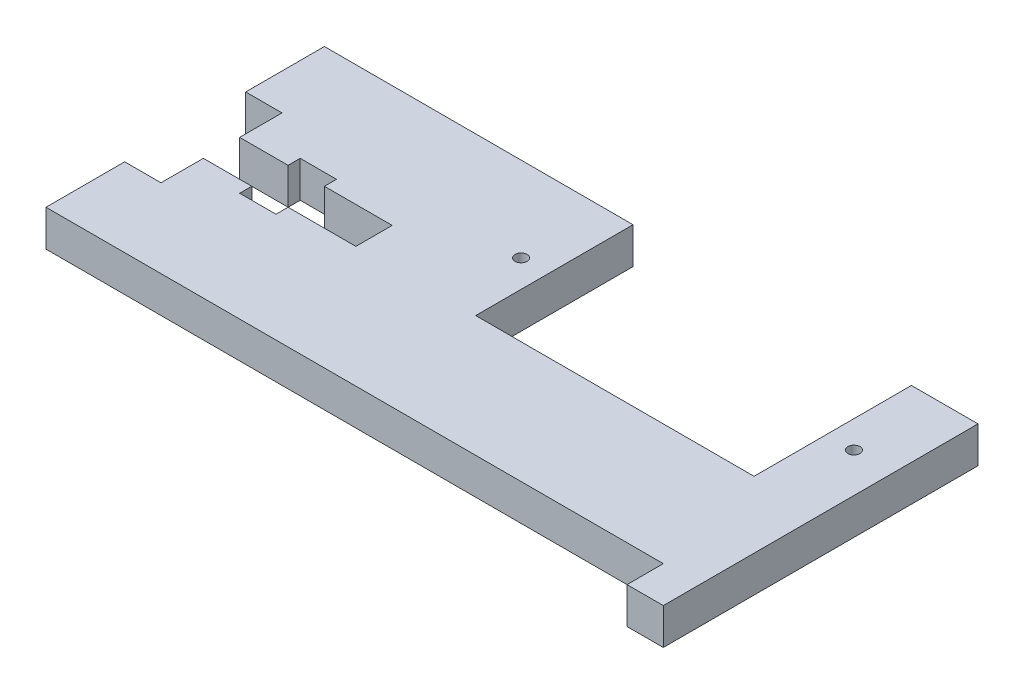
ISO-10303-21;
HEADER;
FILE_DESCRIPTION(('STEP AP214'),'2;1');
FILE_NAME('part.step','',(''),(''),'','','');
FILE_SCHEMA(('AUTOMOTIVE_DESIGN { 1 0 10303 214 1 1 1 1 }'));
ENDSEC;
DATA;
#1=APPLICATION_CONTEXT('core data for automotive mechanical design processes');
#2=APPLICATION_PROTOCOL_DEFINITION('international standard','automotive_design',2000,#1);
#3=PRODUCT_CONTEXT('',#1,'mechanical');
#4=PRODUCT('Part','Part','',(#3));
#5=PRODUCT_RELATED_PRODUCT_CATEGORY('part','',(#4));
#6=PRODUCT_DEFINITION_FORMATION('','',#4);
#7=PRODUCT_DEFINITION_CONTEXT('part definition',#1,'design');
#8=PRODUCT_DEFINITION('design','',#6,#7);
#9=PRODUCT_DEFINITION_SHAPE('','',#8);
#10=(LENGTH_UNIT() NAMED_UNIT(*) SI_UNIT(.MILLI.,.METRE.));
#11=(NAMED_UNIT(*) PLANE_ANGLE_UNIT() SI_UNIT($,.RADIAN.));
#12=(NAMED_UNIT(*) SI_UNIT($,.STERADIAN.) SOLID_ANGLE_UNIT());
#13=UNCERTAINTY_MEASURE_WITH_UNIT(LENGTH_MEASURE(1.E-05),#10,'distance_accuracy_value','');
#14=(GEOMETRIC_REPRESENTATION_CONTEXT(3) GLOBAL_UNCERTAINTY_ASSIGNED_CONTEXT((#13)) GLOBAL_UNIT_ASSIGNED_CONTEXT((#10,
#11,#12)) REPRESENTATION_CONTEXT('',''));
#15=CARTESIAN_POINT('',(0.,0.,0.));
#16=DIRECTION('',(0.,0.,1.));
#17=DIRECTION('',(1.,0.,0.));
#18=AXIS2_PLACEMENT_3D('',#15,#16,#17);
#19=CARTESIAN_POINT('',(0.,3.,0.));
#20=DIRECTION('',(0.,1.,0.));
#21=DIRECTION('',(0.,0.,1.));
#22=AXIS2_PLACEMENT_3D('',#19,#20,#21);
#23=PLANE('',#22);
#24=CARTESIAN_POINT('',(-22.7327283773411,3.,-9.5));
#25=DIRECTION('',(0.,1.,0.));
#26=DIRECTION('',(0.,0.,1.));
#27=AXIS2_PLACEMENT_3D('',#24,#25,#26);
#28=CIRCLE('',#27,0.500000000000003);
#29=CARTESIAN_POINT('',(-22.7327283773411,3.,-9.));
#30=VERTEX_POINT('',#29);
#31=EDGE_CURVE('E248',#30,#30,#28,.T.);
#32=ORIENTED_EDGE('',*,*,#31,.F.);
#33=EDGE_LOOP('',(#32));
#34=FACE_BOUND('',#33,.T.);
#35=DIRECTION('',(-1.,0.,0.));
#36=VECTOR('',#35,1.);
#37=CARTESIAN_POINT('',(-45.9827283773411,3.,0.));
#38=LINE('',#37,#36);
#39=CARTESIAN_POINT('',(-42.9827283773411,3.,0.));
#40=VERTEX_POINT('',#39);
#41=CARTESIAN_POINT('',(-45.9827283773411,3.,0.));
#42=VERTEX_POINT('',#41);
#43=EDGE_CURVE('E300',#40,#42,#38,.T.);
#44=ORIENTED_EDGE('',*,*,#43,.T.);
#45=DIRECTION('',(0.,0.,1.));
#46=VECTOR('',#45,1.);
#47=CARTESIAN_POINT('',(-45.9827283773411,3.,0.));
#48=LINE('',#47,#46);
#49=CARTESIAN_POINT('',(-45.9827283773411,3.,6.5));
#50=VERTEX_POINT('',#49);
#51=EDGE_CURVE('E154',#42,#50,#48,.T.);
#52=ORIENTED_EDGE('',*,*,#51,.T.);
#53=DIRECTION('',(1.,0.,0.));
#54=VECTOR('',#53,1.);
#55=CARTESIAN_POINT('',(-45.9827283773411,3.,6.5));
#56=LINE('',#55,#54);
#57=CARTESIAN_POINT('',(5.01727162265887,3.,6.5));
#58=VERTEX_POINT('',#57);
#59=EDGE_CURVE('E368',#50,#58,#56,.T.);
#60=ORIENTED_EDGE('',*,*,#59,.T.);
#61=DIRECTION('',(0.,0.,1.));
#62=VECTOR('',#61,1.);
#63=CARTESIAN_POINT('',(5.01727162265887,3.,6.5));
#64=LINE('',#63,#62);
#65=CARTESIAN_POINT('',(5.01727162265887,3.,9.5));
#66=VERTEX_POINT('',#65);
#67=EDGE_CURVE('E384',#58,#66,#64,.T.);
#68=ORIENTED_EDGE('',*,*,#67,.T.);
#69=DIRECTION('',(1.,0.,0.));
#70=VECTOR('',#69,1.);
#71=CARTESIAN_POINT('',(5.01727162265887,3.,9.5));
#72=LINE('',#71,#70);
#73=CARTESIAN_POINT('',(8.01727162265886,3.,9.5));
#74=VERTEX_POINT('',#73);
#75=EDGE_CURVE('E385',#66,#74,#72,.T.);
#76=ORIENTED_EDGE('',*,*,#75,.T.);
#77=DIRECTION('',(0.,0.,-1.));
#78=VECTOR('',#77,1.);
#79=CARTESIAN_POINT('',(8.01727162265886,3.,9.5));
#80=LINE('',#79,#78);
#81=CARTESIAN_POINT('',(8.01727162265886,3.,-16.5));
#82=VERTEX_POINT('',#81);
#83=EDGE_CURVE('E383',#74,#82,#80,.T.);
#84=ORIENTED_EDGE('',*,*,#83,.T.);
#85=DIRECTION('',(-1.,0.,0.));
#86=VECTOR('',#85,1.);
#87=CARTESIAN_POINT('',(8.01727162265886,3.,-16.5));
#88=LINE('',#87,#86);
#89=CARTESIAN_POINT('',(2.51727162265887,3.,-16.5));
#90=VERTEX_POINT('',#89);
#91=EDGE_CURVE('E390',#82,#90,#88,.T.);
#92=ORIENTED_EDGE('',*,*,#91,.T.);
#93=DIRECTION('',(0.,0.,1.));
#94=VECTOR('',#93,1.);
#95=CARTESIAN_POINT('',(2.51727162265887,3.,-16.5));
#96=LINE('',#95,#94);
#97=CARTESIAN_POINT('',(2.51727162265887,3.,-3.5));
#98=VERTEX_POINT('',#97);
#99=EDGE_CURVE('E392',#90,#98,#96,.T.);
#100=ORIENTED_EDGE('',*,*,#99,.T.);
#101=DIRECTION('',(-1.,0.,0.));
#102=VECTOR('',#101,1.);
#103=CARTESIAN_POINT('',(2.51727162265887,3.,-3.5));
#104=LINE('',#103,#102);
#105=CARTESIAN_POINT('',(-20.4827283773411,3.,-3.5));
#106=VERTEX_POINT('',#105);
#107=EDGE_CURVE('E394',#98,#106,#104,.T.);
#108=ORIENTED_EDGE('',*,*,#107,.T.);
#109=DIRECTION('',(0.,0.,-1.));
#110=VECTOR('',#109,1.);
#111=CARTESIAN_POINT('',(-20.4827283773411,3.,-3.5));
#112=LINE('',#111,#110);
#113=CARTESIAN_POINT('',(-20.4827283773411,3.,-16.5));
#114=VERTEX_POINT('',#113);
#115=EDGE_CURVE('E399',#106,#114,#112,.T.);
#116=ORIENTED_EDGE('',*,*,#115,.T.);
#117=DIRECTION('',(-1.,0.,0.));
#118=VECTOR('',#117,1.);
#119=CARTESIAN_POINT('',(-20.4827283773411,3.,-16.5));
#120=LINE('',#119,#118);
#121=CARTESIAN_POINT('',(-45.9827283773411,3.,-16.5));
#122=VERTEX_POINT('',#121);
#123=EDGE_CURVE('E396',#114,#122,#120,.T.);
#124=ORIENTED_EDGE('',*,*,#123,.T.);
#125=DIRECTION('',(0.,0.,1.));
#126=VECTOR('',#125,1.);
#127=CARTESIAN_POINT('',(-45.9827283773411,3.,-16.5));
#128=LINE('',#127,#126);
#129=CARTESIAN_POINT('',(-45.9827283773411,3.,-10.));
#130=VERTEX_POINT('',#129);
#131=EDGE_CURVE('E402',#122,#130,#128,.T.);
#132=ORIENTED_EDGE('',*,*,#131,.T.);
#133=DIRECTION('',(1.,0.,0.));
#134=VECTOR('',#133,1.);
#135=CARTESIAN_POINT('',(-45.9827283773411,3.,-10.));
#136=LINE('',#135,#134);
#137=CARTESIAN_POINT('',(-42.9827283773411,3.,-10.));
#138=VERTEX_POINT('',#137);
#139=EDGE_CURVE('E401',#130,#138,#136,.T.);
#140=ORIENTED_EDGE('',*,*,#139,.T.);
#141=DIRECTION('',(0.,0.,1.));
#142=VECTOR('',#141,1.);
#143=CARTESIAN_POINT('',(-42.9827283773411,3.,-10.));
#144=LINE('',#143,#142);
#145=CARTESIAN_POINT('',(-42.9827283773411,3.,-6.5));
#146=VERTEX_POINT('',#145);
#147=EDGE_CURVE('E403',#138,#146,#144,.T.);
#148=ORIENTED_EDGE('',*,*,#147,.T.);
#149=DIRECTION('',(1.,0.,0.));
#150=VECTOR('',#149,1.);
#151=CARTESIAN_POINT('',(-42.9827283773411,3.,-6.5));
#152=LINE('',#151,#150);
#153=CARTESIAN_POINT('',(-38.9827283773411,3.,-6.5));
#154=VERTEX_POINT('',#153);
#155=EDGE_CURVE('E410',#146,#154,#152,.T.);
#156=ORIENTED_EDGE('',*,*,#155,.T.);
#157=DIRECTION('',(0.,0.,-1.));
#158=VECTOR('',#157,1.);
#159=CARTESIAN_POINT('',(-38.9827283773411,3.,-6.5));
#160=LINE('',#159,#158);
#161=CARTESIAN_POINT('',(-38.9827283773411,3.,-7.5));
#162=VERTEX_POINT('',#161);
#163=EDGE_CURVE('E408',#154,#162,#160,.T.);
#164=ORIENTED_EDGE('',*,*,#163,.T.);
#165=DIRECTION('',(1.,0.,0.));
#166=VECTOR('',#165,1.);
#167=CARTESIAN_POINT('',(-38.9827283773411,3.,-7.5));
#168=LINE('',#167,#166);
#169=CARTESIAN_POINT('',(-35.9827283773411,3.,-7.5));
#170=VERTEX_POINT('',#169);
#171=EDGE_CURVE('E412',#162,#170,#168,.T.);
#172=ORIENTED_EDGE('',*,*,#171,.T.);
#173=DIRECTION('',(0.,0.,1.));
#174=VECTOR('',#173,1.);
#175=CARTESIAN_POINT('',(-35.9827283773411,3.,-7.5));
#176=LINE('',#175,#174);
#177=CARTESIAN_POINT('',(-35.9827283773411,3.,-6.5));
#178=VERTEX_POINT('',#177);
#179=EDGE_CURVE('E415',#170,#178,#176,.T.);
#180=ORIENTED_EDGE('',*,*,#179,.T.);
#181=DIRECTION('',(1.,0.,0.));
#182=VECTOR('',#181,1.);
#183=CARTESIAN_POINT('',(-35.9827283773411,3.,-6.5));
#184=LINE('',#183,#182);
#185=CARTESIAN_POINT('',(-30.3827283773411,3.,-6.5));
#186=VERTEX_POINT('',#185);
#187=EDGE_CURVE('E413',#178,#186,#184,.T.);
#188=ORIENTED_EDGE('',*,*,#187,.T.);
#189=DIRECTION('',(0.,0.,1.));
#190=VECTOR('',#189,1.);
#191=CARTESIAN_POINT('',(-30.3827283773411,3.,-6.5));
#192=LINE('',#191,#190);
#193=CARTESIAN_POINT('',(-30.3827283773411,3.,-3.5));
#194=VERTEX_POINT('',#193);
#195=EDGE_CURVE('E417',#186,#194,#192,.T.);
#196=ORIENTED_EDGE('',*,*,#195,.T.);
#197=DIRECTION('',(-1.,0.,0.));
#198=VECTOR('',#197,1.);
#199=CARTESIAN_POINT('',(-35.9827283773411,3.,-3.5));
#200=LINE('',#199,#198);
#201=CARTESIAN_POINT('',(-35.9827283773411,3.,-3.5));
#202=VERTEX_POINT('',#201);
#203=EDGE_CURVE('E420',#194,#202,#200,.T.);
#204=ORIENTED_EDGE('',*,*,#203,.T.);
#205=DIRECTION('',(0.,0.,1.));
#206=VECTOR('',#205,1.);
#207=CARTESIAN_POINT('',(-35.9827283773411,3.,-2.5));
#208=LINE('',#207,#206);
#209=CARTESIAN_POINT('',(-35.9827283773411,3.,-2.5));
#210=VERTEX_POINT('',#209);
#211=EDGE_CURVE('E423',#202,#210,#208,.T.);
#212=ORIENTED_EDGE('',*,*,#211,.T.);
#213=DIRECTION('',(-1.,0.,0.));
#214=VECTOR('',#213,1.);
#215=CARTESIAN_POINT('',(-38.9827283773411,3.,-2.5));
#216=LINE('',#215,#214);
#217=CARTESIAN_POINT('',(-38.9827283773411,3.,-2.5));
#218=VERTEX_POINT('',#217);
#219=EDGE_CURVE('E227',#210,#218,#216,.T.);
#220=ORIENTED_EDGE('',*,*,#219,.T.);
#221=DIRECTION('',(0.,0.,-1.));
#222=VECTOR('',#221,1.);
#223=CARTESIAN_POINT('',(-38.9827283773411,3.,-3.5));
#224=LINE('',#223,#222);
#225=CARTESIAN_POINT('',(-38.9827283773411,3.,-3.5));
#226=VERTEX_POINT('',#225);
#227=EDGE_CURVE('E225',#218,#226,#224,.T.);
#228=ORIENTED_EDGE('',*,*,#227,.T.);
#229=DIRECTION('',(-1.,0.,0.));
#230=VECTOR('',#229,1.);
#231=CARTESIAN_POINT('',(-42.9827283773411,3.,-3.5));
#232=LINE('',#231,#230);
#233=CARTESIAN_POINT('',(-42.9827283773411,3.,-3.5));
#234=VERTEX_POINT('',#233);
#235=EDGE_CURVE('E226',#226,#234,#232,.T.);
#236=ORIENTED_EDGE('',*,*,#235,.T.);
#237=DIRECTION('',(0.,0.,1.));
#238=VECTOR('',#237,1.);
#239=CARTESIAN_POINT('',(-42.9827283773411,3.,0.));
#240=LINE('',#239,#238);
#241=EDGE_CURVE('E59',#234,#40,#240,.T.);
#242=ORIENTED_EDGE('',*,*,#241,.T.);
#243=EDGE_LOOP('',(#44,#52,#60,#68,#76,#84,#92,#100,#108,#116,#124,#132,#140,#148,#156,#164,
#172,#180,#188,#196,#204,#212,#220,#228,#236,#242));
#244=FACE_BOUND('',#243,.T.);
#245=CARTESIAN_POINT('',(4.76727162265887,3.,-9.5));
#246=DIRECTION('',(0.,1.,0.));
#247=DIRECTION('',(0.,0.,1.));
#248=AXIS2_PLACEMENT_3D('',#245,#246,#247);
#249=CIRCLE('',#248,0.500000000000001);
#250=CARTESIAN_POINT('',(4.76727162265887,3.,-9.));
#251=VERTEX_POINT('',#250);
#252=EDGE_CURVE('E462',#251,#251,#249,.T.);
#253=ORIENTED_EDGE('',*,*,#252,.F.);
#254=EDGE_LOOP('',(#253));
#255=FACE_BOUND('',#254,.T.);
#256=ADVANCED_FACE('F41',(#34,#244,#255),#23,.T.);
#257=CARTESIAN_POINT('',(0.,0.,0.));
#258=DIRECTION('',(0.,1.,0.));
#259=DIRECTION('',(0.,0.,1.));
#260=AXIS2_PLACEMENT_3D('',#257,#258,#259);
#261=PLANE('',#260);
#262=DIRECTION('',(-1.,0.,0.));
#263=VECTOR('',#262,1.);
#264=CARTESIAN_POINT('',(-45.9827283773411,0.,0.));
#265=LINE('',#264,#263);
#266=CARTESIAN_POINT('',(-42.9827283773411,0.,0.));
#267=VERTEX_POINT('',#266);
#268=CARTESIAN_POINT('',(-45.9827283773411,0.,0.));
#269=VERTEX_POINT('',#268);
#270=EDGE_CURVE('E247',#267,#269,#265,.T.);
#271=ORIENTED_EDGE('',*,*,#270,.F.);
#272=DIRECTION('',(0.,0.,1.));
#273=VECTOR('',#272,1.);
#274=CARTESIAN_POINT('',(-42.9827283773411,0.,0.));
#275=LINE('',#274,#273);
#276=CARTESIAN_POINT('',(-42.9827283773411,0.,-3.5));
#277=VERTEX_POINT('',#276);
#278=EDGE_CURVE('E150',#277,#267,#275,.T.);
#279=ORIENTED_EDGE('',*,*,#278,.F.);
#280=DIRECTION('',(-1.,0.,0.));
#281=VECTOR('',#280,1.);
#282=CARTESIAN_POINT('',(-42.9827283773411,0.,-3.5));
#283=LINE('',#282,#281);
#284=CARTESIAN_POINT('',(-38.9827283773411,0.,-3.5));
#285=VERTEX_POINT('',#284);
#286=EDGE_CURVE('E143',#285,#277,#283,.T.);
#287=ORIENTED_EDGE('',*,*,#286,.F.);
#288=DIRECTION('',(0.,0.,-1.));
#289=VECTOR('',#288,1.);
#290=CARTESIAN_POINT('',(-38.9827283773411,0.,-3.5));
#291=LINE('',#290,#289);
#292=CARTESIAN_POINT('',(-38.9827283773411,0.,-2.5));
#293=VERTEX_POINT('',#292);
#294=EDGE_CURVE('E237',#293,#285,#291,.T.);
#295=ORIENTED_EDGE('',*,*,#294,.F.);
#296=DIRECTION('',(-1.,0.,0.));
#297=VECTOR('',#296,1.);
#298=CARTESIAN_POINT('',(-38.9827283773411,0.,-2.5));
#299=LINE('',#298,#297);
#300=CARTESIAN_POINT('',(-35.9827283773411,0.,-2.5));
#301=VERTEX_POINT('',#300);
#302=EDGE_CURVE('E295',#301,#293,#299,.T.);
#303=ORIENTED_EDGE('',*,*,#302,.F.);
#304=DIRECTION('',(0.,0.,1.));
#305=VECTOR('',#304,1.);
#306=CARTESIAN_POINT('',(-35.9827283773411,0.,-2.5));
#307=LINE('',#306,#305);
#308=CARTESIAN_POINT('',(-35.9827283773411,0.,-3.5));
#309=VERTEX_POINT('',#308);
#310=EDGE_CURVE('E288',#309,#301,#307,.T.);
#311=ORIENTED_EDGE('',*,*,#310,.F.);
#312=DIRECTION('',(-1.,0.,0.));
#313=VECTOR('',#312,1.);
#314=CARTESIAN_POINT('',(-35.9827283773411,0.,-3.5));
#315=LINE('',#314,#313);
#316=CARTESIAN_POINT('',(-30.3827283773411,0.,-3.5));
#317=VERTEX_POINT('',#316);
#318=EDGE_CURVE('E290',#317,#309,#315,.T.);
#319=ORIENTED_EDGE('',*,*,#318,.F.);
#320=DIRECTION('',(0.,0.,1.));
#321=VECTOR('',#320,1.);
#322=CARTESIAN_POINT('',(-30.3827283773411,0.,-6.5));
#323=LINE('',#322,#321);
#324=CARTESIAN_POINT('',(-30.3827283773411,0.,-6.5));
#325=VERTEX_POINT('',#324);
#326=EDGE_CURVE('E287',#325,#317,#323,.T.);
#327=ORIENTED_EDGE('',*,*,#326,.F.);
#328=DIRECTION('',(1.,0.,0.));
#329=VECTOR('',#328,1.);
#330=CARTESIAN_POINT('',(-35.9827283773411,0.,-6.5));
#331=LINE('',#330,#329);
#332=CARTESIAN_POINT('',(-35.9827283773411,0.,-6.5));
#333=VERTEX_POINT('',#332);
#334=EDGE_CURVE('E283',#333,#325,#331,.T.);
#335=ORIENTED_EDGE('',*,*,#334,.F.);
#336=DIRECTION('',(0.,0.,1.));
#337=VECTOR('',#336,1.);
#338=CARTESIAN_POINT('',(-35.9827283773411,0.,-7.5));
#339=LINE('',#338,#337);
#340=CARTESIAN_POINT('',(-35.9827283773411,0.,-7.5));
#341=VERTEX_POINT('',#340);
#342=EDGE_CURVE('E285',#341,#333,#339,.T.);
#343=ORIENTED_EDGE('',*,*,#342,.F.);
#344=DIRECTION('',(1.,0.,0.));
#345=VECTOR('',#344,1.);
#346=CARTESIAN_POINT('',(-38.9827283773411,0.,-7.5));
#347=LINE('',#346,#345);
#348=CARTESIAN_POINT('',(-38.9827283773411,0.,-7.5));
#349=VERTEX_POINT('',#348);
#350=EDGE_CURVE('E278',#349,#341,#347,.T.);
#351=ORIENTED_EDGE('',*,*,#350,.F.);
#352=DIRECTION('',(0.,0.,-1.));
#353=VECTOR('',#352,1.);
#354=CARTESIAN_POINT('',(-38.9827283773411,0.,-6.5));
#355=LINE('',#354,#353);
#356=CARTESIAN_POINT('',(-38.9827283773411,0.,-6.5));
#357=VERTEX_POINT('',#356);
#358=EDGE_CURVE('E279',#357,#349,#355,.T.);
#359=ORIENTED_EDGE('',*,*,#358,.F.);
#360=DIRECTION('',(1.,0.,0.));
#361=VECTOR('',#360,1.);
#362=CARTESIAN_POINT('',(-42.9827283773411,0.,-6.5));
#363=LINE('',#362,#361);
#364=CARTESIAN_POINT('',(-42.9827283773411,0.,-6.5));
#365=VERTEX_POINT('',#364);
#366=EDGE_CURVE('E277',#365,#357,#363,.T.);
#367=ORIENTED_EDGE('',*,*,#366,.F.);
#368=DIRECTION('',(0.,0.,1.));
#369=VECTOR('',#368,1.);
#370=CARTESIAN_POINT('',(-42.9827283773411,0.,-10.));
#371=LINE('',#370,#369);
#372=CARTESIAN_POINT('',(-42.9827283773411,0.,-10.));
#373=VERTEX_POINT('',#372);
#374=EDGE_CURVE('E273',#373,#365,#371,.T.);
#375=ORIENTED_EDGE('',*,*,#374,.F.);
#376=DIRECTION('',(1.,0.,0.));
#377=VECTOR('',#376,1.);
#378=CARTESIAN_POINT('',(-45.9827283773411,0.,-10.));
#379=LINE('',#378,#377);
#380=CARTESIAN_POINT('',(-45.9827283773411,0.,-10.));
#381=VERTEX_POINT('',#380);
#382=EDGE_CURVE('E275',#381,#373,#379,.T.);
#383=ORIENTED_EDGE('',*,*,#382,.F.);
#384=DIRECTION('',(0.,0.,1.));
#385=VECTOR('',#384,1.);
#386=CARTESIAN_POINT('',(-45.9827283773411,0.,-16.5));
#387=LINE('',#386,#385);
#388=CARTESIAN_POINT('',(-45.9827283773411,0.,-16.5));
#389=VERTEX_POINT('',#388);
#390=EDGE_CURVE('E269',#389,#381,#387,.T.);
#391=ORIENTED_EDGE('',*,*,#390,.F.);
#392=DIRECTION('',(-1.,0.,0.));
#393=VECTOR('',#392,1.);
#394=CARTESIAN_POINT('',(-20.4827283773411,0.,-16.5));
#395=LINE('',#394,#393);
#396=CARTESIAN_POINT('',(-20.4827283773411,0.,-16.5));
#397=VERTEX_POINT('',#396);
#398=EDGE_CURVE('E268',#397,#389,#395,.T.);
#399=ORIENTED_EDGE('',*,*,#398,.F.);
#400=DIRECTION('',(0.,0.,-1.));
#401=VECTOR('',#400,1.);
#402=CARTESIAN_POINT('',(-20.4827283773411,0.,-3.5));
#403=LINE('',#402,#401);
#404=CARTESIAN_POINT('',(-20.4827283773411,0.,-3.5));
#405=VERTEX_POINT('',#404);
#406=EDGE_CURVE('E266',#405,#397,#403,.T.);
#407=ORIENTED_EDGE('',*,*,#406,.F.);
#408=DIRECTION('',(-1.,0.,0.));
#409=VECTOR('',#408,1.);
#410=CARTESIAN_POINT('',(2.51727162265887,0.,-3.5));
#411=LINE('',#410,#409);
#412=CARTESIAN_POINT('',(2.51727162265887,0.,-3.5));
#413=VERTEX_POINT('',#412);
#414=EDGE_CURVE('E262',#413,#405,#411,.T.);
#415=ORIENTED_EDGE('',*,*,#414,.F.);
#416=DIRECTION('',(0.,0.,1.));
#417=VECTOR('',#416,1.);
#418=CARTESIAN_POINT('',(2.51727162265887,0.,-16.5));
#419=LINE('',#418,#417);
#420=CARTESIAN_POINT('',(2.51727162265887,0.,-16.5));
#421=VERTEX_POINT('',#420);
#422=EDGE_CURVE('E265',#421,#413,#419,.T.);
#423=ORIENTED_EDGE('',*,*,#422,.F.);
#424=DIRECTION('',(-1.,0.,0.));
#425=VECTOR('',#424,1.);
#426=CARTESIAN_POINT('',(8.01727162265886,0.,-16.5));
#427=LINE('',#426,#425);
#428=CARTESIAN_POINT('',(8.01727162265886,0.,-16.5));
#429=VERTEX_POINT('',#428);
#430=EDGE_CURVE('E257',#429,#421,#427,.T.);
#431=ORIENTED_EDGE('',*,*,#430,.F.);
#432=DIRECTION('',(0.,0.,-1.));
#433=VECTOR('',#432,1.);
#434=CARTESIAN_POINT('',(8.01727162265886,0.,9.5));
#435=LINE('',#434,#433);
#436=CARTESIAN_POINT('',(8.01727162265886,0.,9.5));
#437=VERTEX_POINT('',#436);
#438=EDGE_CURVE('E256',#437,#429,#435,.T.);
#439=ORIENTED_EDGE('',*,*,#438,.F.);
#440=DIRECTION('',(1.,0.,0.));
#441=VECTOR('',#440,1.);
#442=CARTESIAN_POINT('',(5.01727162265887,0.,9.5));
#443=LINE('',#442,#441);
#444=CARTESIAN_POINT('',(5.01727162265887,0.,9.5));
#445=VERTEX_POINT('',#444);
#446=EDGE_CURVE('E258',#445,#437,#443,.T.);
#447=ORIENTED_EDGE('',*,*,#446,.F.);
#448=DIRECTION('',(0.,0.,1.));
#449=VECTOR('',#448,1.);
#450=CARTESIAN_POINT('',(5.01727162265887,0.,6.5));
#451=LINE('',#450,#449);
#452=CARTESIAN_POINT('',(5.01727162265887,0.,6.5));
#453=VERTEX_POINT('',#452);
#454=EDGE_CURVE('E255',#453,#445,#451,.T.);
#455=ORIENTED_EDGE('',*,*,#454,.F.);
#456=DIRECTION('',(1.,0.,0.));
#457=VECTOR('',#456,1.);
#458=CARTESIAN_POINT('',(-45.9827283773411,0.,6.5));
#459=LINE('',#458,#457);
#460=CARTESIAN_POINT('',(-45.9827283773411,0.,6.5));
#461=VERTEX_POINT('',#460);
#462=EDGE_CURVE('E252',#461,#453,#459,.T.);
#463=ORIENTED_EDGE('',*,*,#462,.F.);
#464=DIRECTION('',(0.,0.,1.));
#465=VECTOR('',#464,1.);
#466=CARTESIAN_POINT('',(-45.9827283773411,0.,0.));
#467=LINE('',#466,#465);
#468=EDGE_CURVE('E246',#269,#461,#467,.T.);
#469=ORIENTED_EDGE('',*,*,#468,.F.);
#470=EDGE_LOOP('',(#271,#279,#287,#295,#303,#311,#319,#327,#335,#343,#351,#359,#367,#375,#383,
#391,#399,#407,#415,#423,#431,#439,#447,#455,#463,#469));
#471=FACE_BOUND('',#470,.T.);
#472=CARTESIAN_POINT('',(-22.7327283773411,0.,-9.5));
#473=DIRECTION('',(0.,1.,0.));
#474=DIRECTION('',(0.,0.,1.));
#475=AXIS2_PLACEMENT_3D('',#472,#473,#474);
#476=CIRCLE('',#475,0.500000000000003);
#477=CARTESIAN_POINT('',(-22.7327283773411,0.,-9.));
#478=VERTEX_POINT('',#477);
#479=EDGE_CURVE('E466',#478,#478,#476,.T.);
#480=ORIENTED_EDGE('',*,*,#479,.T.);
#481=EDGE_LOOP('',(#480));
#482=FACE_BOUND('',#481,.T.);
#483=CARTESIAN_POINT('',(4.76727162265887,0.,-9.5));
#484=DIRECTION('',(0.,1.,0.));
#485=DIRECTION('',(0.,0.,1.));
#486=AXIS2_PLACEMENT_3D('',#483,#484,#485);
#487=CIRCLE('',#486,0.500000000000001);
#488=CARTESIAN_POINT('',(4.76727162265887,0.,-9.));
#489=VERTEX_POINT('',#488);
#490=EDGE_CURVE('E467',#489,#489,#487,.T.);
#491=ORIENTED_EDGE('',*,*,#490,.T.);
#492=EDGE_LOOP('',(#491));
#493=FACE_BOUND('',#492,.T.);
#494=ADVANCED_FACE('F367',(#471,#482,#493),#261,.F.);
#495=CARTESIAN_POINT('',(-45.9827283773411,3.,0.));
#496=DIRECTION('',(0.,0.,1.));
#497=DIRECTION('',(1.,0.,0.));
#498=AXIS2_PLACEMENT_3D('',#495,#496,#497);
#499=PLANE('',#498);
#500=ORIENTED_EDGE('',*,*,#270,.T.);
#501=DIRECTION('',(0.,-1.,0.));
#502=VECTOR('',#501,1.);
#503=CARTESIAN_POINT('',(-45.9827283773411,3.,0.));
#504=LINE('',#503,#502);
#505=EDGE_CURVE('E11',#42,#269,#504,.T.);
#506=ORIENTED_EDGE('',*,*,#505,.F.);
#507=ORIENTED_EDGE('',*,*,#43,.F.);
#508=DIRECTION('',(0.,-1.,0.));
#509=VECTOR('',#508,1.);
#510=CARTESIAN_POINT('',(-42.9827283773411,3.,0.));
#511=LINE('',#510,#509);
#512=EDGE_CURVE('E245',#40,#267,#511,.T.);
#513=ORIENTED_EDGE('',*,*,#512,.T.);
#514=EDGE_LOOP('',(#500,#506,#507,#513));
#515=FACE_BOUND('',#514,.T.);
#516=ADVANCED_FACE('F43',(#515),#499,.F.);
#517=CARTESIAN_POINT('',(-45.9827283773411,3.,0.));
#518=DIRECTION('',(1.,0.,0.));
#519=DIRECTION('',(0.,0.,-1.));
#520=AXIS2_PLACEMENT_3D('',#517,#518,#519);
#521=PLANE('',#520);
#522=ORIENTED_EDGE('',*,*,#468,.T.);
#523=DIRECTION('',(0.,-1.,0.));
#524=VECTOR('',#523,1.);
#525=CARTESIAN_POINT('',(-45.9827283773411,3.,6.5));
#526=LINE('',#525,#524);
#527=EDGE_CURVE('E49',#50,#461,#526,.T.);
#528=ORIENTED_EDGE('',*,*,#527,.F.);
#529=ORIENTED_EDGE('',*,*,#51,.F.);
#530=ORIENTED_EDGE('',*,*,#505,.T.);
#531=EDGE_LOOP('',(#522,#528,#529,#530));
#532=FACE_BOUND('',#531,.T.);
#533=ADVANCED_FACE('F702',(#532),#521,.F.);
#534=CARTESIAN_POINT('',(-45.9827283773411,3.,6.5));
#535=DIRECTION('',(0.,0.,-1.));
#536=DIRECTION('',(-1.,0.,0.));
#537=AXIS2_PLACEMENT_3D('',#534,#535,#536);
#538=PLANE('',#537);
#539=ORIENTED_EDGE('',*,*,#462,.T.);
#540=DIRECTION('',(0.,-1.,0.));
#541=VECTOR('',#540,1.);
#542=CARTESIAN_POINT('',(5.01727162265887,3.,6.5));
#543=LINE('',#542,#541);
#544=EDGE_CURVE('E360',#58,#453,#543,.T.);
#545=ORIENTED_EDGE('',*,*,#544,.F.);
#546=ORIENTED_EDGE('',*,*,#59,.F.);
#547=ORIENTED_EDGE('',*,*,#527,.T.);
#548=EDGE_LOOP('',(#539,#545,#546,#547));
#549=FACE_BOUND('',#548,.T.);
#550=ADVANCED_FACE('F365',(#549),#538,.F.);
#551=CARTESIAN_POINT('',(5.01727162265887,3.,6.5));
#552=DIRECTION('',(1.,0.,0.));
#553=DIRECTION('',(0.,0.,-1.));
#554=AXIS2_PLACEMENT_3D('',#551,#552,#553);
#555=PLANE('',#554);
#556=ORIENTED_EDGE('',*,*,#454,.T.);
#557=DIRECTION('',(0.,-1.,0.));
#558=VECTOR('',#557,1.);
#559=CARTESIAN_POINT('',(5.01727162265887,3.,9.5));
#560=LINE('',#559,#558);
#561=EDGE_CURVE('E354',#66,#445,#560,.T.);
#562=ORIENTED_EDGE('',*,*,#561,.F.);
#563=ORIENTED_EDGE('',*,*,#67,.F.);
#564=ORIENTED_EDGE('',*,*,#544,.T.);
#565=EDGE_LOOP('',(#556,#562,#563,#564));
#566=FACE_BOUND('',#565,.T.);
#567=ADVANCED_FACE('F376',(#566),#555,.F.);
#568=CARTESIAN_POINT('',(5.01727162265887,3.,9.5));
#569=DIRECTION('',(0.,0.,-1.));
#570=DIRECTION('',(-1.,0.,0.));
#571=AXIS2_PLACEMENT_3D('',#568,#569,#570);
#572=PLANE('',#571);
#573=ORIENTED_EDGE('',*,*,#446,.T.);
#574=DIRECTION('',(0.,-1.,0.));
#575=VECTOR('',#574,1.);
#576=CARTESIAN_POINT('',(8.01727162265886,3.,9.5));
#577=LINE('',#576,#575);
#578=EDGE_CURVE('E355',#74,#437,#577,.T.);
#579=ORIENTED_EDGE('',*,*,#578,.F.);
#580=ORIENTED_EDGE('',*,*,#75,.F.);
#581=ORIENTED_EDGE('',*,*,#561,.T.);
#582=EDGE_LOOP('',(#573,#579,#580,#581));
#583=FACE_BOUND('',#582,.T.);
#584=ADVANCED_FACE('F379',(#583),#572,.F.);
#585=CARTESIAN_POINT('',(8.01727162265886,3.,9.5));
#586=DIRECTION('',(-1.,0.,0.));
#587=DIRECTION('',(0.,0.,1.));
#588=AXIS2_PLACEMENT_3D('',#585,#586,#587);
#589=PLANE('',#588);
#590=ORIENTED_EDGE('',*,*,#438,.T.);
#591=DIRECTION('',(0.,-1.,0.));
#592=VECTOR('',#591,1.);
#593=CARTESIAN_POINT('',(8.01727162265886,3.,-16.5));
#594=LINE('',#593,#592);
#595=EDGE_CURVE('E349',#82,#429,#594,.T.);
#596=ORIENTED_EDGE('',*,*,#595,.F.);
#597=ORIENTED_EDGE('',*,*,#83,.F.);
#598=ORIENTED_EDGE('',*,*,#578,.T.);
#599=EDGE_LOOP('',(#590,#596,#597,#598));
#600=FACE_BOUND('',#599,.T.);
#601=ADVANCED_FACE('F668',(#600),#589,.F.);
#602=CARTESIAN_POINT('',(8.01727162265886,3.,-16.5));
#603=DIRECTION('',(0.,0.,1.));
#604=DIRECTION('',(1.,0.,0.));
#605=AXIS2_PLACEMENT_3D('',#602,#603,#604);
#606=PLANE('',#605);
#607=ORIENTED_EDGE('',*,*,#430,.T.);
#608=DIRECTION('',(0.,-1.,0.));
#609=VECTOR('',#608,1.);
#610=CARTESIAN_POINT('',(2.51727162265887,3.,-16.5));
#611=LINE('',#610,#609);
#612=EDGE_CURVE('E347',#90,#421,#611,.T.);
#613=ORIENTED_EDGE('',*,*,#612,.F.);
#614=ORIENTED_EDGE('',*,*,#91,.F.);
#615=ORIENTED_EDGE('',*,*,#595,.T.);
#616=EDGE_LOOP('',(#607,#613,#614,#615));
#617=FACE_BOUND('',#616,.T.);
#618=ADVANCED_FACE('F658',(#617),#606,.F.);
#619=CARTESIAN_POINT('',(2.51727162265887,3.,-16.5));
#620=DIRECTION('',(1.,0.,0.));
#621=DIRECTION('',(0.,0.,-1.));
#622=AXIS2_PLACEMENT_3D('',#619,#620,#621);
#623=PLANE('',#622);
#624=ORIENTED_EDGE('',*,*,#422,.T.);
#625=DIRECTION('',(0.,-1.,0.));
#626=VECTOR('',#625,1.);
#627=CARTESIAN_POINT('',(2.51727162265887,3.,-3.5));
#628=LINE('',#627,#626);
#629=EDGE_CURVE('E345',#98,#413,#628,.T.);
#630=ORIENTED_EDGE('',*,*,#629,.F.);
#631=ORIENTED_EDGE('',*,*,#99,.F.);
#632=ORIENTED_EDGE('',*,*,#612,.T.);
#633=EDGE_LOOP('',(#624,#630,#631,#632));
#634=FACE_BOUND('',#633,.T.);
#635=ADVANCED_FACE('F647',(#634),#623,.F.);
#636=CARTESIAN_POINT('',(2.51727162265887,3.,-3.5));
#637=DIRECTION('',(0.,0.,1.));
#638=DIRECTION('',(1.,0.,0.));
#639=AXIS2_PLACEMENT_3D('',#636,#637,#638);
#640=PLANE('',#639);
#641=ORIENTED_EDGE('',*,*,#414,.T.);
#642=DIRECTION('',(0.,-1.,0.));
#643=VECTOR('',#642,1.);
#644=CARTESIAN_POINT('',(-20.4827283773411,3.,-3.5));
#645=LINE('',#644,#643);
#646=EDGE_CURVE('E339',#106,#405,#645,.T.);
#647=ORIENTED_EDGE('',*,*,#646,.F.);
#648=ORIENTED_EDGE('',*,*,#107,.F.);
#649=ORIENTED_EDGE('',*,*,#629,.T.);
#650=EDGE_LOOP('',(#641,#647,#648,#649));
#651=FACE_BOUND('',#650,.T.);
#652=ADVANCED_FACE('F640',(#651),#640,.F.);
#653=CARTESIAN_POINT('',(-20.4827283773411,3.,-3.5));
#654=DIRECTION('',(-1.,0.,0.));
#655=DIRECTION('',(0.,0.,1.));
#656=AXIS2_PLACEMENT_3D('',#653,#654,#655);
#657=PLANE('',#656);
#658=ORIENTED_EDGE('',*,*,#406,.T.);
#659=DIRECTION('',(0.,-1.,0.));
#660=VECTOR('',#659,1.);
#661=CARTESIAN_POINT('',(-20.4827283773411,3.,-16.5));
#662=LINE('',#661,#660);
#663=EDGE_CURVE('E340',#114,#397,#662,.T.);
#664=ORIENTED_EDGE('',*,*,#663,.F.);
#665=ORIENTED_EDGE('',*,*,#115,.F.);
#666=ORIENTED_EDGE('',*,*,#646,.T.);
#667=EDGE_LOOP('',(#658,#664,#665,#666));
#668=FACE_BOUND('',#667,.T.);
#669=ADVANCED_FACE('F628',(#668),#657,.F.);
#670=CARTESIAN_POINT('',(-20.4827283773411,3.,-16.5));
#671=DIRECTION('',(0.,0.,1.));
#672=DIRECTION('',(1.,0.,0.));
#673=AXIS2_PLACEMENT_3D('',#670,#671,#672);
#674=PLANE('',#673);
#675=ORIENTED_EDGE('',*,*,#398,.T.);
#676=DIRECTION('',(0.,-1.,0.));
#677=VECTOR('',#676,1.);
#678=CARTESIAN_POINT('',(-45.9827283773411,3.,-16.5));
#679=LINE('',#678,#677);
#680=EDGE_CURVE('E331',#122,#389,#679,.T.);
#681=ORIENTED_EDGE('',*,*,#680,.F.);
#682=ORIENTED_EDGE('',*,*,#123,.F.);
#683=ORIENTED_EDGE('',*,*,#663,.T.);
#684=EDGE_LOOP('',(#675,#681,#682,#683));
#685=FACE_BOUND('',#684,.T.);
#686=ADVANCED_FACE('F616',(#685),#674,.F.);
#687=CARTESIAN_POINT('',(-45.9827283773411,3.,-16.5));
#688=DIRECTION('',(1.,0.,0.));
#689=DIRECTION('',(0.,0.,-1.));
#690=AXIS2_PLACEMENT_3D('',#687,#688,#689);
#691=PLANE('',#690);
#692=ORIENTED_EDGE('',*,*,#390,.T.);
#693=DIRECTION('',(0.,-1.,0.));
#694=VECTOR('',#693,1.);
#695=CARTESIAN_POINT('',(-45.9827283773411,3.,-10.));
#696=LINE('',#695,#694);
#697=EDGE_CURVE('E332',#130,#381,#696,.T.);
#698=ORIENTED_EDGE('',*,*,#697,.F.);
#699=ORIENTED_EDGE('',*,*,#131,.F.);
#700=ORIENTED_EDGE('',*,*,#680,.T.);
#701=EDGE_LOOP('',(#692,#698,#699,#700));
#702=FACE_BOUND('',#701,.T.);
#703=ADVANCED_FACE('F606',(#702),#691,.F.);
#704=CARTESIAN_POINT('',(-45.9827283773411,3.,-10.));
#705=DIRECTION('',(0.,0.,-1.));
#706=DIRECTION('',(-1.,0.,0.));
#707=AXIS2_PLACEMENT_3D('',#704,#705,#706);
#708=PLANE('',#707);
#709=ORIENTED_EDGE('',*,*,#382,.T.);
#710=DIRECTION('',(0.,-1.,0.));
#711=VECTOR('',#710,1.);
#712=CARTESIAN_POINT('',(-42.9827283773411,3.,-10.));
#713=LINE('',#712,#711);
#714=EDGE_CURVE('E327',#138,#373,#713,.T.);
#715=ORIENTED_EDGE('',*,*,#714,.F.);
#716=ORIENTED_EDGE('',*,*,#139,.F.);
#717=ORIENTED_EDGE('',*,*,#697,.T.);
#718=EDGE_LOOP('',(#709,#715,#716,#717));
#719=FACE_BOUND('',#718,.T.);
#720=ADVANCED_FACE('F597',(#719),#708,.F.);
#721=CARTESIAN_POINT('',(-42.9827283773411,3.,-10.));
#722=DIRECTION('',(1.,0.,0.));
#723=DIRECTION('',(0.,0.,-1.));
#724=AXIS2_PLACEMENT_3D('',#721,#722,#723);
#725=PLANE('',#724);
#726=ORIENTED_EDGE('',*,*,#374,.T.);
#727=DIRECTION('',(0.,-1.,0.));
#728=VECTOR('',#727,1.);
#729=CARTESIAN_POINT('',(-42.9827283773411,3.,-6.5));
#730=LINE('',#729,#728);
#731=EDGE_CURVE('E324',#146,#365,#730,.T.);
#732=ORIENTED_EDGE('',*,*,#731,.F.);
#733=ORIENTED_EDGE('',*,*,#147,.F.);
#734=ORIENTED_EDGE('',*,*,#714,.T.);
#735=EDGE_LOOP('',(#726,#732,#733,#734));
#736=FACE_BOUND('',#735,.T.);
#737=ADVANCED_FACE('F589',(#736),#725,.F.);
#738=CARTESIAN_POINT('',(-42.9827283773411,3.,-6.5));
#739=DIRECTION('',(0.,0.,-1.));
#740=DIRECTION('',(-1.,0.,0.));
#741=AXIS2_PLACEMENT_3D('',#738,#739,#740);
#742=PLANE('',#741);
#743=ORIENTED_EDGE('',*,*,#366,.T.);
#744=DIRECTION('',(0.,-1.,0.));
#745=VECTOR('',#744,1.);
#746=CARTESIAN_POINT('',(-38.9827283773411,3.,-6.5));
#747=LINE('',#746,#745);
#748=EDGE_CURVE('E325',#154,#357,#747,.T.);
#749=ORIENTED_EDGE('',*,*,#748,.F.);
#750=ORIENTED_EDGE('',*,*,#155,.F.);
#751=ORIENTED_EDGE('',*,*,#731,.T.);
#752=EDGE_LOOP('',(#743,#749,#750,#751));
#753=FACE_BOUND('',#752,.T.);
#754=ADVANCED_FACE('F576',(#753),#742,.F.);
#755=CARTESIAN_POINT('',(-38.9827283773411,3.,-6.5));
#756=DIRECTION('',(-1.,0.,0.));
#757=DIRECTION('',(0.,0.,1.));
#758=AXIS2_PLACEMENT_3D('',#755,#756,#757);
#759=PLANE('',#758);
#760=ORIENTED_EDGE('',*,*,#358,.T.);
#761=DIRECTION('',(0.,-1.,0.));
#762=VECTOR('',#761,1.);
#763=CARTESIAN_POINT('',(-38.9827283773411,3.,-7.5));
#764=LINE('',#763,#762);
#765=EDGE_CURVE('E317',#162,#349,#764,.T.);
#766=ORIENTED_EDGE('',*,*,#765,.F.);
#767=ORIENTED_EDGE('',*,*,#163,.F.);
#768=ORIENTED_EDGE('',*,*,#748,.T.);
#769=EDGE_LOOP('',(#760,#766,#767,#768));
#770=FACE_BOUND('',#769,.T.);
#771=ADVANCED_FACE('F569',(#770),#759,.F.);
#772=CARTESIAN_POINT('',(-38.9827283773411,3.,-7.5));
#773=DIRECTION('',(0.,0.,-1.));
#774=DIRECTION('',(-1.,0.,0.));
#775=AXIS2_PLACEMENT_3D('',#772,#773,#774);
#776=PLANE('',#775);
#777=ORIENTED_EDGE('',*,*,#350,.T.);
#778=DIRECTION('',(0.,-1.,0.));
#779=VECTOR('',#778,1.);
#780=CARTESIAN_POINT('',(-35.9827283773411,3.,-7.5));
#781=LINE('',#780,#779);
#782=EDGE_CURVE('E316',#170,#341,#781,.T.);
#783=ORIENTED_EDGE('',*,*,#782,.F.);
#784=ORIENTED_EDGE('',*,*,#171,.F.);
#785=ORIENTED_EDGE('',*,*,#765,.T.);
#786=EDGE_LOOP('',(#777,#783,#784,#785));
#787=FACE_BOUND('',#786,.T.);
#788=ADVANCED_FACE('F558',(#787),#776,.F.);
#789=CARTESIAN_POINT('',(-35.9827283773411,3.,-7.5));
#790=DIRECTION('',(1.,0.,0.));
#791=DIRECTION('',(0.,0.,-1.));
#792=AXIS2_PLACEMENT_3D('',#789,#790,#791);
#793=PLANE('',#792);
#794=ORIENTED_EDGE('',*,*,#342,.T.);
#795=DIRECTION('',(0.,-1.,0.));
#796=VECTOR('',#795,1.);
#797=CARTESIAN_POINT('',(-35.9827283773411,3.,-6.5));
#798=LINE('',#797,#796);
#799=EDGE_CURVE('E311',#178,#333,#798,.T.);
#800=ORIENTED_EDGE('',*,*,#799,.F.);
#801=ORIENTED_EDGE('',*,*,#179,.F.);
#802=ORIENTED_EDGE('',*,*,#782,.T.);
#803=EDGE_LOOP('',(#794,#800,#801,#802));
#804=FACE_BOUND('',#803,.T.);
#805=ADVANCED_FACE('F548',(#804),#793,.F.);
#806=CARTESIAN_POINT('',(-35.9827283773411,3.,-6.5));
#807=DIRECTION('',(0.,0.,-1.));
#808=DIRECTION('',(-1.,0.,0.));
#809=AXIS2_PLACEMENT_3D('',#806,#807,#808);
#810=PLANE('',#809);
#811=ORIENTED_EDGE('',*,*,#334,.T.);
#812=DIRECTION('',(0.,-1.,0.));
#813=VECTOR('',#812,1.);
#814=CARTESIAN_POINT('',(-30.3827283773411,3.,-6.5));
#815=LINE('',#814,#813);
#816=EDGE_CURVE('E309',#186,#325,#815,.T.);
#817=ORIENTED_EDGE('',*,*,#816,.F.);
#818=ORIENTED_EDGE('',*,*,#187,.F.);
#819=ORIENTED_EDGE('',*,*,#799,.T.);
#820=EDGE_LOOP('',(#811,#817,#818,#819));
#821=FACE_BOUND('',#820,.T.);
#822=ADVANCED_FACE('F537',(#821),#810,.F.);
#823=CARTESIAN_POINT('',(-30.3827283773411,3.,-6.5));
#824=DIRECTION('',(1.,0.,0.));
#825=DIRECTION('',(0.,0.,-1.));
#826=AXIS2_PLACEMENT_3D('',#823,#824,#825);
#827=PLANE('',#826);
#828=ORIENTED_EDGE('',*,*,#326,.T.);
#829=DIRECTION('',(0.,-1.,0.));
#830=VECTOR('',#829,1.);
#831=CARTESIAN_POINT('',(-30.3827283773411,3.,-3.5));
#832=LINE('',#831,#830);
#833=EDGE_CURVE('E307',#194,#317,#832,.T.);
#834=ORIENTED_EDGE('',*,*,#833,.F.);
#835=ORIENTED_EDGE('',*,*,#195,.F.);
#836=ORIENTED_EDGE('',*,*,#816,.T.);
#837=EDGE_LOOP('',(#828,#834,#835,#836));
#838=FACE_BOUND('',#837,.T.);
#839=ADVANCED_FACE('F530',(#838),#827,.F.);
#840=CARTESIAN_POINT('',(-35.9827283773411,3.,-3.5));
#841=DIRECTION('',(0.,0.,1.));
#842=DIRECTION('',(1.,0.,0.));
#843=AXIS2_PLACEMENT_3D('',#840,#841,#842);
#844=PLANE('',#843);
#845=ORIENTED_EDGE('',*,*,#318,.T.);
#846=DIRECTION('',(0.,-1.,0.));
#847=VECTOR('',#846,1.);
#848=CARTESIAN_POINT('',(-35.9827283773411,3.,-3.5));
#849=LINE('',#848,#847);
#850=EDGE_CURVE('E301',#202,#309,#849,.T.);
#851=ORIENTED_EDGE('',*,*,#850,.F.);
#852=ORIENTED_EDGE('',*,*,#203,.F.);
#853=ORIENTED_EDGE('',*,*,#833,.T.);
#854=EDGE_LOOP('',(#845,#851,#852,#853));
#855=FACE_BOUND('',#854,.T.);
#856=ADVANCED_FACE('F519',(#855),#844,.F.);
#857=CARTESIAN_POINT('',(-35.9827283773411,3.,-2.5));
#858=DIRECTION('',(1.,0.,0.));
#859=DIRECTION('',(0.,0.,-1.));
#860=AXIS2_PLACEMENT_3D('',#857,#858,#859);
#861=PLANE('',#860);
#862=ORIENTED_EDGE('',*,*,#310,.T.);
#863=DIRECTION('',(0.,-1.,0.));
#864=VECTOR('',#863,1.);
#865=CARTESIAN_POINT('',(-35.9827283773411,3.,-2.5));
#866=LINE('',#865,#864);
#867=EDGE_CURVE('E302',#210,#301,#866,.T.);
#868=ORIENTED_EDGE('',*,*,#867,.F.);
#869=ORIENTED_EDGE('',*,*,#211,.F.);
#870=ORIENTED_EDGE('',*,*,#850,.T.);
#871=EDGE_LOOP('',(#862,#868,#869,#870));
#872=FACE_BOUND('',#871,.T.);
#873=ADVANCED_FACE('F430',(#872),#861,.F.);
#874=CARTESIAN_POINT('',(-38.9827283773411,3.,-2.5));
#875=DIRECTION('',(0.,0.,1.));
#876=DIRECTION('',(1.,0.,0.));
#877=AXIS2_PLACEMENT_3D('',#874,#875,#876);
#878=PLANE('',#877);
#879=ORIENTED_EDGE('',*,*,#302,.T.);
#880=DIRECTION('',(0.,-1.,0.));
#881=VECTOR('',#880,1.);
#882=CARTESIAN_POINT('',(-38.9827283773411,3.,-2.5));
#883=LINE('',#882,#881);
#884=EDGE_CURVE('E240',#218,#293,#883,.T.);
#885=ORIENTED_EDGE('',*,*,#884,.F.);
#886=ORIENTED_EDGE('',*,*,#219,.F.);
#887=ORIENTED_EDGE('',*,*,#867,.T.);
#888=EDGE_LOOP('',(#879,#885,#886,#887));
#889=FACE_BOUND('',#888,.T.);
#890=ADVANCED_FACE('F431',(#889),#878,.F.);
#891=CARTESIAN_POINT('',(-38.9827283773411,3.,-3.5));
#892=DIRECTION('',(-1.,0.,0.));
#893=DIRECTION('',(0.,0.,1.));
#894=AXIS2_PLACEMENT_3D('',#891,#892,#893);
#895=PLANE('',#894);
#896=ORIENTED_EDGE('',*,*,#294,.T.);
#897=DIRECTION('',(0.,-1.,0.));
#898=VECTOR('',#897,1.);
#899=CARTESIAN_POINT('',(-38.9827283773411,3.,-3.5));
#900=LINE('',#899,#898);
#901=EDGE_CURVE('E235',#226,#285,#900,.T.);
#902=ORIENTED_EDGE('',*,*,#901,.F.);
#903=ORIENTED_EDGE('',*,*,#227,.F.);
#904=ORIENTED_EDGE('',*,*,#884,.T.);
#905=EDGE_LOOP('',(#896,#902,#903,#904));
#906=FACE_BOUND('',#905,.T.);
#907=ADVANCED_FACE('F231',(#906),#895,.F.);
#908=CARTESIAN_POINT('',(-42.9827283773411,3.,-3.5));
#909=DIRECTION('',(0.,0.,1.));
#910=DIRECTION('',(1.,0.,0.));
#911=AXIS2_PLACEMENT_3D('',#908,#909,#910);
#912=PLANE('',#911);
#913=ORIENTED_EDGE('',*,*,#286,.T.);
#914=DIRECTION('',(0.,-1.,0.));
#915=VECTOR('',#914,1.);
#916=CARTESIAN_POINT('',(-42.9827283773411,3.,-3.5));
#917=LINE('',#916,#915);
#918=EDGE_CURVE('E236',#234,#277,#917,.T.);
#919=ORIENTED_EDGE('',*,*,#918,.F.);
#920=ORIENTED_EDGE('',*,*,#235,.F.);
#921=ORIENTED_EDGE('',*,*,#901,.T.);
#922=EDGE_LOOP('',(#913,#919,#920,#921));
#923=FACE_BOUND('',#922,.T.);
#924=ADVANCED_FACE('F238',(#923),#912,.F.);
#925=CARTESIAN_POINT('',(-42.9827283773411,3.,0.));
#926=DIRECTION('',(1.,0.,0.));
#927=DIRECTION('',(0.,0.,-1.));
#928=AXIS2_PLACEMENT_3D('',#925,#926,#927);
#929=PLANE('',#928);
#930=ORIENTED_EDGE('',*,*,#278,.T.);
#931=ORIENTED_EDGE('',*,*,#512,.F.);
#932=ORIENTED_EDGE('',*,*,#241,.F.);
#933=ORIENTED_EDGE('',*,*,#918,.T.);
#934=EDGE_LOOP('',(#930,#931,#932,#933));
#935=FACE_BOUND('',#934,.T.);
#936=ADVANCED_FACE('F434',(#935),#929,.F.);
#937=CARTESIAN_POINT('',(-22.7327283773411,3.,-9.5));
#938=DIRECTION('',(0.,-1.,0.));
#939=DIRECTION('',(0.,0.,-1.));
#940=AXIS2_PLACEMENT_3D('',#937,#938,#939);
#941=CYLINDRICAL_SURFACE('',#940,0.500000000000003);
#942=ORIENTED_EDGE('',*,*,#31,.T.);
#943=EDGE_LOOP('',(#942));
#944=FACE_BOUND('',#943,.T.);
#945=ORIENTED_EDGE('',*,*,#479,.F.);
#946=EDGE_LOOP('',(#945));
#947=FACE_BOUND('',#946,.T.);
#948=ADVANCED_FACE('F440',(#944,#947),#941,.F.);
#949=CARTESIAN_POINT('',(4.76727162265887,3.,-9.5));
#950=DIRECTION('',(0.,-1.,0.));
#951=DIRECTION('',(0.,0.,-1.));
#952=AXIS2_PLACEMENT_3D('',#949,#950,#951);
#953=CYLINDRICAL_SURFACE('',#952,0.500000000000001);
#954=ORIENTED_EDGE('',*,*,#252,.T.);
#955=EDGE_LOOP('',(#954));
#956=FACE_BOUND('',#955,.T.);
#957=ORIENTED_EDGE('',*,*,#490,.F.);
#958=EDGE_LOOP('',(#957));
#959=FACE_BOUND('',#958,.T.);
#960=ADVANCED_FACE('F444',(#956,#959),#953,.F.);
#961=CLOSED_SHELL('',(#256,#494,#516,#533,#550,#567,#584,#601,#618,#635,#652,#669,#686,#703,
#720,#737,#754,#771,#788,#805,#822,#839,#856,#873,#890,#907,#924,#936,#948,#960));
#962=MANIFOLD_SOLID_BREP('B2',#961);
#963=ADVANCED_BREP_SHAPE_REPRESENTATION('',(#18,#962),#14);
#964=SHAPE_DEFINITION_REPRESENTATION(#9,#963);
ENDSEC;
END-ISO-10303-21;
